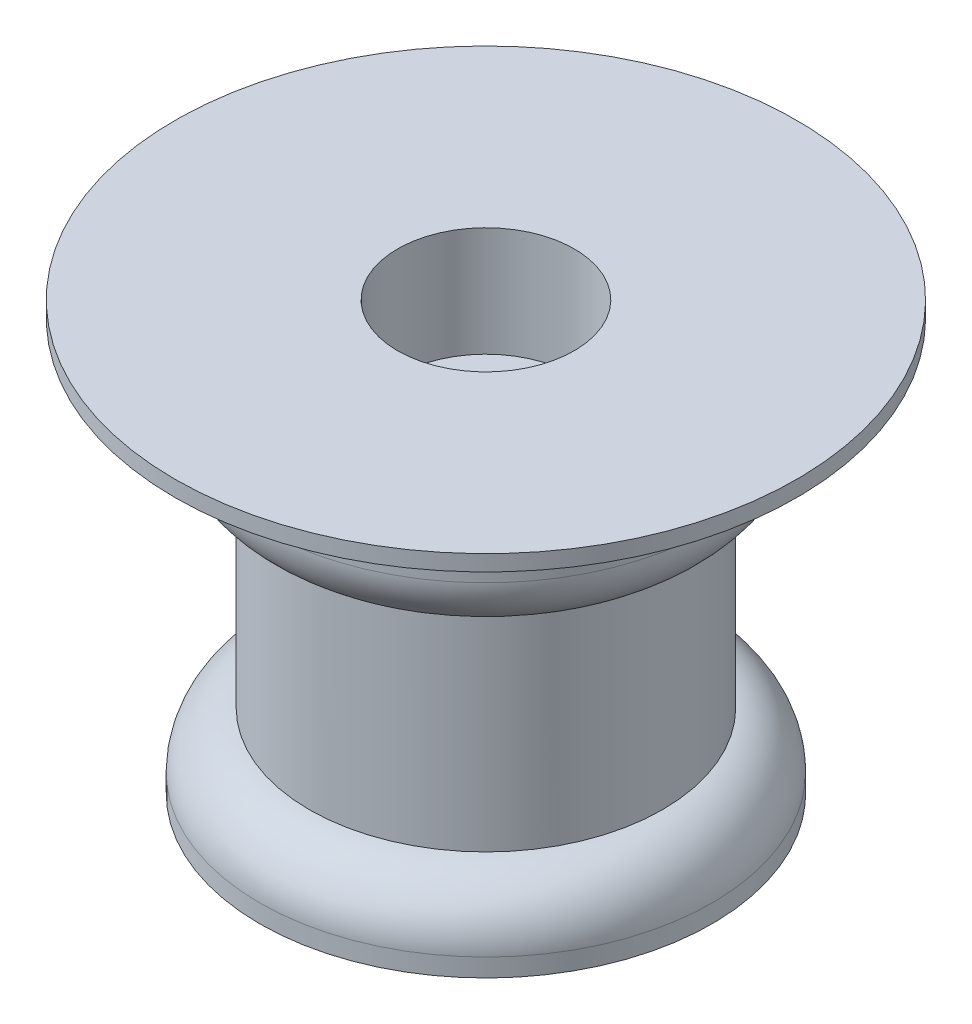
ISO-10303-21;
HEADER;
FILE_DESCRIPTION(('STEP AP214'),'2;1');
FILE_NAME('part.step','',(''),(''),'','','');
FILE_SCHEMA(('AUTOMOTIVE_DESIGN { 1 0 10303 214 1 1 1 1 }'));
ENDSEC;
DATA;
#1=APPLICATION_CONTEXT('core data for automotive mechanical design processes');
#2=APPLICATION_PROTOCOL_DEFINITION('international standard','automotive_design',2000,#1);
#3=PRODUCT_CONTEXT('',#1,'mechanical');
#4=PRODUCT('Part','Part','',(#3));
#5=PRODUCT_RELATED_PRODUCT_CATEGORY('part','',(#4));
#6=PRODUCT_DEFINITION_FORMATION('','',#4);
#7=PRODUCT_DEFINITION_CONTEXT('part definition',#1,'design');
#8=PRODUCT_DEFINITION('design','',#6,#7);
#9=PRODUCT_DEFINITION_SHAPE('','',#8);
#10=(LENGTH_UNIT() NAMED_UNIT(*) SI_UNIT(.MILLI.,.METRE.));
#11=(NAMED_UNIT(*) PLANE_ANGLE_UNIT() SI_UNIT($,.RADIAN.));
#12=(NAMED_UNIT(*) SI_UNIT($,.STERADIAN.) SOLID_ANGLE_UNIT());
#13=UNCERTAINTY_MEASURE_WITH_UNIT(LENGTH_MEASURE(1.E-05),#10,'distance_accuracy_value','');
#14=(GEOMETRIC_REPRESENTATION_CONTEXT(3) GLOBAL_UNCERTAINTY_ASSIGNED_CONTEXT((#13)) GLOBAL_UNIT_ASSIGNED_CONTEXT((#10,
#11,#12)) REPRESENTATION_CONTEXT('',''));
#15=CARTESIAN_POINT('',(0.,0.,0.));
#16=DIRECTION('',(0.,0.,1.));
#17=DIRECTION('',(1.,0.,0.));
#18=AXIS2_PLACEMENT_3D('',#15,#16,#17);
#19=CARTESIAN_POINT('',(0.,51.,0.));
#20=DIRECTION('',(0.,-1.,0.));
#21=DIRECTION('',(0.,0.,-1.));
#22=AXIS2_PLACEMENT_3D('',#19,#20,#21);
#23=CYLINDRICAL_SURFACE('',#22,2.3);
#24=CARTESIAN_POINT('',(0.,40.,0.));
#25=DIRECTION('',(0.,-1.,0.));
#26=DIRECTION('',(0.,0.,-1.));
#27=AXIS2_PLACEMENT_3D('',#24,#25,#26);
#28=CIRCLE('',#27,2.3);
#29=CARTESIAN_POINT('',(0.,40.,-2.3));
#30=VERTEX_POINT('',#29);
#31=EDGE_CURVE('E59',#30,#30,#28,.T.);
#32=ORIENTED_EDGE('',*,*,#31,.T.);
#33=EDGE_LOOP('',(#32));
#34=FACE_BOUND('',#33,.T.);
#35=CARTESIAN_POINT('',(0.,45.,0.));
#36=DIRECTION('',(0.,1.,0.));
#37=DIRECTION('',(0.,0.,1.));
#38=AXIS2_PLACEMENT_3D('',#35,#36,#37);
#39=CIRCLE('',#38,2.3);
#40=CARTESIAN_POINT('',(0.,45.,2.3));
#41=VERTEX_POINT('',#40);
#42=EDGE_CURVE('E51',#41,#41,#39,.T.);
#43=ORIENTED_EDGE('',*,*,#42,.T.);
#44=EDGE_LOOP('',(#43));
#45=FACE_BOUND('',#44,.T.);
#46=ADVANCED_FACE('F33',(#34,#45),#23,.F.);
#47=CARTESIAN_POINT('',(0.,51.,0.));
#48=DIRECTION('',(0.,-1.,0.));
#49=DIRECTION('',(0.,0.,-1.));
#50=AXIS2_PLACEMENT_3D('',#47,#48,#49);
#51=CYLINDRICAL_SURFACE('',#50,32.);
#52=CARTESIAN_POINT('',(0.,50.25,0.));
#53=DIRECTION('',(0.,1.,0.));
#54=DIRECTION('',(0.,0.,1.));
#55=AXIS2_PLACEMENT_3D('',#52,#53,#54);
#56=CIRCLE('',#55,32.);
#57=CARTESIAN_POINT('',(0.,50.25,32.));
#58=VERTEX_POINT('',#57);
#59=EDGE_CURVE('E10',#58,#58,#56,.F.);
#60=ORIENTED_EDGE('',*,*,#59,.T.);
#61=EDGE_LOOP('',(#60));
#62=FACE_BOUND('',#61,.T.);
#63=CARTESIAN_POINT('',(0.,48.4372539331938,0.));
#64=DIRECTION('',(0.,-1.,0.));
#65=DIRECTION('',(0.,0.,-1.));
#66=AXIS2_PLACEMENT_3D('',#63,#64,#65);
#67=CIRCLE('',#66,32.);
#68=CARTESIAN_POINT('',(0.,48.4372539331938,-32.));
#69=VERTEX_POINT('',#68);
#70=EDGE_CURVE('E44',#69,#69,#67,.F.);
#71=ORIENTED_EDGE('',*,*,#70,.T.);
#72=EDGE_LOOP('',(#71));
#73=FACE_BOUND('',#72,.T.);
#74=ADVANCED_FACE('F105',(#62,#73),#51,.T.);
#75=CARTESIAN_POINT('',(0.,0.,0.));
#76=DIRECTION('',(0.,1.,0.));
#77=DIRECTION('',(0.,0.,1.));
#78=AXIS2_PLACEMENT_3D('',#75,#76,#77);
#79=PLANE('',#78);
#80=CARTESIAN_POINT('',(0.,0.,0.));
#81=DIRECTION('',(0.,-1.,0.));
#82=DIRECTION('',(0.,0.,-1.));
#83=AXIS2_PLACEMENT_3D('',#80,#81,#82);
#84=CIRCLE('',#83,13.15);
#85=CARTESIAN_POINT('',(0.,0.,-13.15));
#86=VERTEX_POINT('',#85);
#87=EDGE_CURVE('E65',#86,#86,#84,.T.);
#88=ORIENTED_EDGE('',*,*,#87,.F.);
#89=EDGE_LOOP('',(#88));
#90=FACE_BOUND('',#89,.T.);
#91=CARTESIAN_POINT('',(0.,0.,0.));
#92=DIRECTION('',(0.,1.,0.));
#93=DIRECTION('',(0.,0.,1.));
#94=AXIS2_PLACEMENT_3D('',#91,#92,#93);
#95=CIRCLE('',#94,32.);
#96=CARTESIAN_POINT('',(0.,0.,32.));
#97=VERTEX_POINT('',#96);
#98=EDGE_CURVE('E58',#97,#97,#95,.T.);
#99=ORIENTED_EDGE('',*,*,#98,.F.);
#100=EDGE_LOOP('',(#99));
#101=FACE_BOUND('',#100,.T.);
#102=ADVANCED_FACE('F112',(#90,#101),#79,.F.);
#103=CARTESIAN_POINT('',(0.,2.56274606680623,0.));
#104=DIRECTION('',(0.,1.,0.));
#105=DIRECTION('',(0.,0.,1.));
#106=AXIS2_PLACEMENT_3D('',#103,#104,#105);
#107=CIRCLE('',#106,32.);
#108=CARTESIAN_POINT('',(0.,2.56274606680623,32.));
#109=VERTEX_POINT('',#108);
#110=EDGE_CURVE('E48',#109,#109,#107,.F.);
#111=ORIENTED_EDGE('',*,*,#110,.T.);
#112=EDGE_LOOP('',(#111));
#113=FACE_BOUND('',#112,.T.);
#114=ORIENTED_EDGE('',*,*,#98,.T.);
#115=EDGE_LOOP('',(#114));
#116=FACE_BOUND('',#115,.T.);
#117=ADVANCED_FACE('F114',(#113,#116),#51,.T.);
#118=CARTESIAN_POINT('',(0.,40.,0.));
#119=DIRECTION('',(0.,-1.,0.));
#120=DIRECTION('',(0.,0.,-1.));
#121=AXIS2_PLACEMENT_3D('',#118,#119,#120);
#122=CYLINDRICAL_SURFACE('',#121,13.15);
#123=CARTESIAN_POINT('',(0.,40.,0.));
#124=DIRECTION('',(0.,-1.,0.));
#125=DIRECTION('',(0.,0.,-1.));
#126=AXIS2_PLACEMENT_3D('',#123,#124,#125);
#127=CIRCLE('',#126,13.15);
#128=CARTESIAN_POINT('',(0.,40.,-13.15));
#129=VERTEX_POINT('',#128);
#130=EDGE_CURVE('E62',#129,#129,#127,.T.);
#131=ORIENTED_EDGE('',*,*,#130,.F.);
#132=EDGE_LOOP('',(#131));
#133=FACE_BOUND('',#132,.T.);
#134=ORIENTED_EDGE('',*,*,#87,.T.);
#135=EDGE_LOOP('',(#134));
#136=FACE_BOUND('',#135,.T.);
#137=ADVANCED_FACE('F118',(#133,#136),#122,.F.);
#138=CARTESIAN_POINT('',(0.,40.,0.));
#139=DIRECTION('',(0.,-1.,0.));
#140=DIRECTION('',(0.,0.,-1.));
#141=AXIS2_PLACEMENT_3D('',#138,#139,#140);
#142=PLANE('',#141);
#143=ORIENTED_EDGE('',*,*,#31,.F.);
#144=EDGE_LOOP('',(#143));
#145=FACE_BOUND('',#144,.T.);
#146=ORIENTED_EDGE('',*,*,#130,.T.);
#147=EDGE_LOOP('',(#146));
#148=FACE_BOUND('',#147,.T.);
#149=ADVANCED_FACE('F141',(#145,#148),#142,.T.);
#150=CARTESIAN_POINT('',(0.,40.5,0.));
#151=DIRECTION('',(0.,-1.,0.));
#152=DIRECTION('',(0.,0.,-1.));
#153=AXIS2_PLACEMENT_3D('',#150,#151,#152);
#154=CYLINDRICAL_SURFACE('',#153,25.);
#155=CARTESIAN_POINT('',(0.,40.5,0.));
#156=DIRECTION('',(0.,-1.,0.));
#157=DIRECTION('',(0.,0.,-1.));
#158=AXIS2_PLACEMENT_3D('',#155,#156,#157);
#159=CIRCLE('',#158,25.);
#160=CARTESIAN_POINT('',(0.,40.5,-25.));
#161=VERTEX_POINT('',#160);
#162=EDGE_CURVE('E68',#161,#161,#159,.T.);
#163=ORIENTED_EDGE('',*,*,#162,.T.);
#164=EDGE_LOOP('',(#163));
#165=FACE_BOUND('',#164,.T.);
#166=CARTESIAN_POINT('',(0.,10.5,0.));
#167=DIRECTION('',(0.,-1.,0.));
#168=DIRECTION('',(0.,0.,-1.));
#169=AXIS2_PLACEMENT_3D('',#166,#167,#168);
#170=CIRCLE('',#169,25.);
#171=CARTESIAN_POINT('',(0.,10.5,-25.));
#172=VERTEX_POINT('',#171);
#173=EDGE_CURVE('E53',#172,#172,#170,.T.);
#174=ORIENTED_EDGE('',*,*,#173,.F.);
#175=EDGE_LOOP('',(#174));
#176=FACE_BOUND('',#175,.T.);
#177=ADVANCED_FACE('F127',(#165,#176),#154,.T.);
#178=CARTESIAN_POINT('',(0.,2.56274606680623,0.));
#179=DIRECTION('',(0.,1.,0.));
#180=DIRECTION('',(0.,0.,1.));
#181=AXIS2_PLACEMENT_3D('',#178,#179,#180);
#182=TOROIDAL_SURFACE('',#181,24.,8.);
#183=ORIENTED_EDGE('',*,*,#173,.T.);
#184=EDGE_LOOP('',(#183));
#185=FACE_BOUND('',#184,.T.);
#186=ORIENTED_EDGE('',*,*,#110,.F.);
#187=EDGE_LOOP('',(#186));
#188=FACE_BOUND('',#187,.T.);
#189=ADVANCED_FACE('F124',(#185,#188),#182,.T.);
#190=CARTESIAN_POINT('',(0.,48.4372539331938,0.));
#191=DIRECTION('',(0.,-1.,0.));
#192=DIRECTION('',(0.,0.,-1.));
#193=AXIS2_PLACEMENT_3D('',#190,#191,#192);
#194=TOROIDAL_SURFACE('',#193,24.,8.);
#195=ORIENTED_EDGE('',*,*,#70,.F.);
#196=EDGE_LOOP('',(#195));
#197=FACE_BOUND('',#196,.T.);
#198=ORIENTED_EDGE('',*,*,#162,.F.);
#199=EDGE_LOOP('',(#198));
#200=FACE_BOUND('',#199,.T.);
#201=ADVANCED_FACE('F126',(#197,#200),#194,.T.);
#202=CARTESIAN_POINT('',(0.,45.,0.));
#203=DIRECTION('',(0.,1.,0.));
#204=DIRECTION('',(0.,0.,1.));
#205=AXIS2_PLACEMENT_3D('',#202,#203,#204);
#206=CYLINDRICAL_SURFACE('',#205,12.5);
#207=CARTESIAN_POINT('',(0.,45.,0.));
#208=DIRECTION('',(0.,1.,0.));
#209=DIRECTION('',(0.,0.,1.));
#210=AXIS2_PLACEMENT_3D('',#207,#208,#209);
#211=CIRCLE('',#210,12.5);
#212=CARTESIAN_POINT('',(0.,45.,12.5));
#213=VERTEX_POINT('',#212);
#214=EDGE_CURVE('E54',#213,#213,#211,.T.);
#215=ORIENTED_EDGE('',*,*,#214,.F.);
#216=EDGE_LOOP('',(#215));
#217=FACE_BOUND('',#216,.T.);
#218=CARTESIAN_POINT('',(0.,60.5,0.));
#219=DIRECTION('',(0.,1.,0.));
#220=DIRECTION('',(0.,0.,1.));
#221=AXIS2_PLACEMENT_3D('',#218,#219,#220);
#222=CIRCLE('',#221,12.5);
#223=CARTESIAN_POINT('',(0.,60.5,12.5));
#224=VERTEX_POINT('',#223);
#225=EDGE_CURVE('E81',#224,#224,#222,.T.);
#226=ORIENTED_EDGE('',*,*,#225,.T.);
#227=EDGE_LOOP('',(#226));
#228=FACE_BOUND('',#227,.T.);
#229=ADVANCED_FACE('F87',(#217,#228),#206,.F.);
#230=CARTESIAN_POINT('',(0.,45.,0.));
#231=DIRECTION('',(0.,1.,0.));
#232=DIRECTION('',(0.,0.,1.));
#233=AXIS2_PLACEMENT_3D('',#230,#231,#232);
#234=PLANE('',#233);
#235=ORIENTED_EDGE('',*,*,#42,.F.);
#236=EDGE_LOOP('',(#235));
#237=FACE_BOUND('',#236,.T.);
#238=ORIENTED_EDGE('',*,*,#214,.T.);
#239=EDGE_LOOP('',(#238));
#240=FACE_BOUND('',#239,.T.);
#241=ADVANCED_FACE('F92',(#237,#240),#234,.T.);
#242=CARTESIAN_POINT('',(0.,60.5,0.));
#243=DIRECTION('',(0.,1.,0.));
#244=DIRECTION('',(0.,0.,1.));
#245=AXIS2_PLACEMENT_3D('',#242,#243,#244);
#246=PLANE('',#245);
#247=CARTESIAN_POINT('',(0.,60.5,0.));
#248=DIRECTION('',(0.,1.,0.));
#249=DIRECTION('',(0.,0.,1.));
#250=AXIS2_PLACEMENT_3D('',#247,#248,#249);
#251=CIRCLE('',#250,44.);
#252=CARTESIAN_POINT('',(0.,60.5,44.));
#253=VERTEX_POINT('',#252);
#254=EDGE_CURVE('E77',#253,#253,#251,.T.);
#255=ORIENTED_EDGE('',*,*,#254,.T.);
#256=EDGE_LOOP('',(#255));
#257=FACE_BOUND('',#256,.T.);
#258=ORIENTED_EDGE('',*,*,#225,.F.);
#259=EDGE_LOOP('',(#258));
#260=FACE_BOUND('',#259,.T.);
#261=ADVANCED_FACE('F89',(#257,#260),#246,.T.);
#262=CARTESIAN_POINT('',(0.,58.25,0.));
#263=DIRECTION('',(0.,1.,0.));
#264=DIRECTION('',(0.,0.,1.));
#265=AXIS2_PLACEMENT_3D('',#262,#263,#264);
#266=PLANE('',#265);
#267=CARTESIAN_POINT('',(0.,58.25,0.));
#268=DIRECTION('',(0.,1.,0.));
#269=DIRECTION('',(0.,0.,1.));
#270=AXIS2_PLACEMENT_3D('',#267,#268,#269);
#271=CIRCLE('',#270,40.);
#272=CARTESIAN_POINT('',(0.,58.25,40.));
#273=VERTEX_POINT('',#272);
#274=EDGE_CURVE('E40',#273,#273,#271,.T.);
#275=ORIENTED_EDGE('',*,*,#274,.T.);
#276=EDGE_LOOP('',(#275));
#277=FACE_BOUND('',#276,.T.);
#278=CARTESIAN_POINT('',(0.,58.25,0.));
#279=DIRECTION('',(0.,1.,0.));
#280=DIRECTION('',(0.,0.,1.));
#281=AXIS2_PLACEMENT_3D('',#278,#279,#280);
#282=CIRCLE('',#281,44.);
#283=CARTESIAN_POINT('',(0.,58.25,44.));
#284=VERTEX_POINT('',#283);
#285=EDGE_CURVE('E78',#284,#284,#282,.T.);
#286=ORIENTED_EDGE('',*,*,#285,.F.);
#287=EDGE_LOOP('',(#286));
#288=FACE_BOUND('',#287,.T.);
#289=ADVANCED_FACE('F91',(#277,#288),#266,.F.);
#290=CARTESIAN_POINT('',(0.,60.5,0.));
#291=DIRECTION('',(0.,-1.,0.));
#292=DIRECTION('',(0.,0.,-1.));
#293=AXIS2_PLACEMENT_3D('',#290,#291,#292);
#294=CYLINDRICAL_SURFACE('',#293,44.);
#295=ORIENTED_EDGE('',*,*,#254,.F.);
#296=EDGE_LOOP('',(#295));
#297=FACE_BOUND('',#296,.T.);
#298=ORIENTED_EDGE('',*,*,#285,.T.);
#299=EDGE_LOOP('',(#298));
#300=FACE_BOUND('',#299,.T.);
#301=ADVANCED_FACE('F99',(#297,#300),#294,.T.);
#302=CARTESIAN_POINT('',(0.,50.25,0.));
#303=DIRECTION('',(0.,1.,0.));
#304=DIRECTION('',(0.,0.,1.));
#305=AXIS2_PLACEMENT_3D('',#302,#303,#304);
#306=TOROIDAL_SURFACE('',#305,40.,8.);
#307=ORIENTED_EDGE('',*,*,#59,.F.);
#308=EDGE_LOOP('',(#307));
#309=FACE_BOUND('',#308,.T.);
#310=ORIENTED_EDGE('',*,*,#274,.F.);
#311=EDGE_LOOP('',(#310));
#312=FACE_BOUND('',#311,.T.);
#313=ADVANCED_FACE('F35',(#309,#312),#306,.F.);
#314=CLOSED_SHELL('',(#46,#74,#102,#117,#137,#149,#177,#189,#201,#229,#241,#261,#289,#301,#313));
#315=MANIFOLD_SOLID_BREP('B2',#314);
#316=ADVANCED_BREP_SHAPE_REPRESENTATION('',(#18,#315),#14);
#317=SHAPE_DEFINITION_REPRESENTATION(#9,#316);
ENDSEC;
END-ISO-10303-21;
